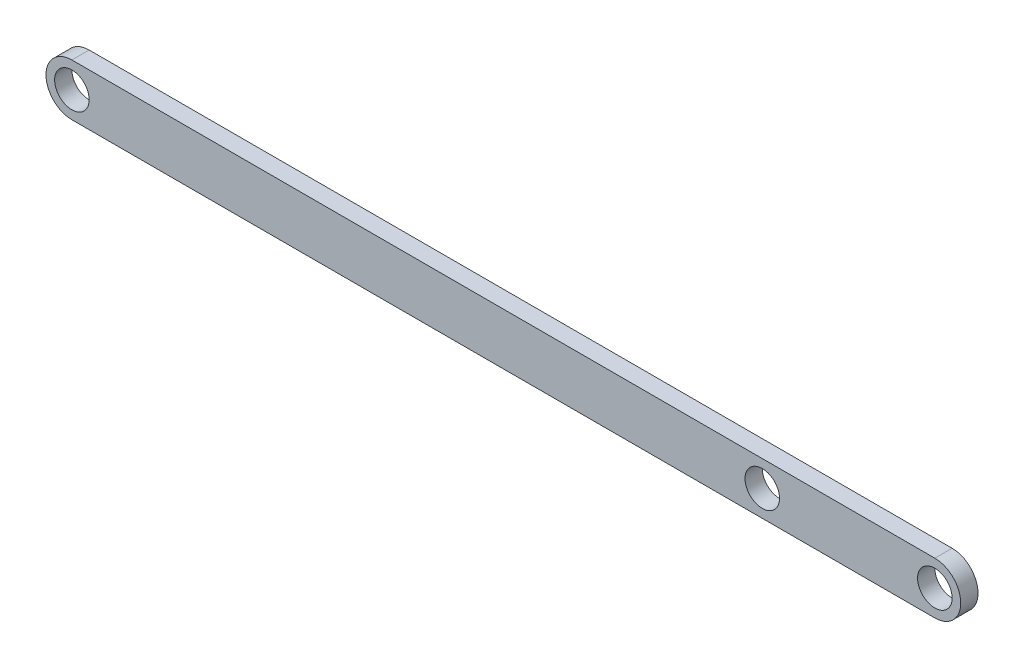
ISO-10303-21;
HEADER;
FILE_DESCRIPTION(('STEP AP214'),'2;1');
FILE_NAME('part.step','',(''),(''),'','','');
FILE_SCHEMA(('AUTOMOTIVE_DESIGN { 1 0 10303 214 1 1 1 1 }'));
ENDSEC;
DATA;
#1=APPLICATION_CONTEXT('core data for automotive mechanical design processes');
#2=APPLICATION_PROTOCOL_DEFINITION('international standard','automotive_design',2000,#1);
#3=PRODUCT_CONTEXT('',#1,'mechanical');
#4=PRODUCT('Part','Part','',(#3));
#5=PRODUCT_RELATED_PRODUCT_CATEGORY('part','',(#4));
#6=PRODUCT_DEFINITION_FORMATION('','',#4);
#7=PRODUCT_DEFINITION_CONTEXT('part definition',#1,'design');
#8=PRODUCT_DEFINITION('design','',#6,#7);
#9=PRODUCT_DEFINITION_SHAPE('','',#8);
#10=(LENGTH_UNIT() NAMED_UNIT(*) SI_UNIT(.MILLI.,.METRE.));
#11=(NAMED_UNIT(*) PLANE_ANGLE_UNIT() SI_UNIT($,.RADIAN.));
#12=(NAMED_UNIT(*) SI_UNIT($,.STERADIAN.) SOLID_ANGLE_UNIT());
#13=UNCERTAINTY_MEASURE_WITH_UNIT(LENGTH_MEASURE(1.E-05),#10,'distance_accuracy_value','');
#14=(GEOMETRIC_REPRESENTATION_CONTEXT(3) GLOBAL_UNCERTAINTY_ASSIGNED_CONTEXT((#13)) GLOBAL_UNIT_ASSIGNED_CONTEXT((#10,
#11,#12)) REPRESENTATION_CONTEXT('',''));
#15=CARTESIAN_POINT('',(0.,0.,0.));
#16=DIRECTION('',(0.,0.,1.));
#17=DIRECTION('',(1.,0.,0.));
#18=AXIS2_PLACEMENT_3D('',#15,#16,#17);
#19=CARTESIAN_POINT('',(0.,30.,10.));
#20=DIRECTION('',(0.,-1.,0.));
#21=DIRECTION('',(1.,0.,0.));
#22=AXIS2_PLACEMENT_3D('',#19,#20,#21);
#23=PLANE('',#22);
#24=DIRECTION('',(-1.,0.,0.));
#25=VECTOR('',#24,1.);
#26=CARTESIAN_POINT('',(0.,30.,0.));
#27=LINE('',#26,#25);
#28=CARTESIAN_POINT('',(0.,30.,0.));
#29=VERTEX_POINT('',#28);
#30=CARTESIAN_POINT('',(-500.,29.9999999999999,0.));
#31=VERTEX_POINT('',#30);
#32=EDGE_CURVE('E100',#29,#31,#27,.T.);
#33=ORIENTED_EDGE('',*,*,#32,.T.);
#34=DIRECTION('',(0.,0.,-1.));
#35=VECTOR('',#34,1.);
#36=CARTESIAN_POINT('',(-500.,29.9999999999999,10.));
#37=LINE('',#36,#35);
#38=CARTESIAN_POINT('',(-500.,29.9999999999999,10.));
#39=VERTEX_POINT('',#38);
#40=EDGE_CURVE('E11',#39,#31,#37,.T.);
#41=ORIENTED_EDGE('',*,*,#40,.F.);
#42=DIRECTION('',(-1.,0.,0.));
#43=VECTOR('',#42,1.);
#44=CARTESIAN_POINT('',(0.,30.,10.));
#45=LINE('',#44,#43);
#46=CARTESIAN_POINT('',(0.,30.,10.));
#47=VERTEX_POINT('',#46);
#48=EDGE_CURVE('E85',#47,#39,#45,.T.);
#49=ORIENTED_EDGE('',*,*,#48,.F.);
#50=DIRECTION('',(0.,0.,-1.));
#51=VECTOR('',#50,1.);
#52=CARTESIAN_POINT('',(0.,30.,10.));
#53=LINE('',#52,#51);
#54=EDGE_CURVE('E96',#47,#29,#53,.T.);
#55=ORIENTED_EDGE('',*,*,#54,.T.);
#56=EDGE_LOOP('',(#33,#41,#49,#55));
#57=FACE_BOUND('',#56,.T.);
#58=ADVANCED_FACE('F38',(#57),#23,.F.);
#59=CARTESIAN_POINT('',(-500.,14.9999999999999,10.));
#60=DIRECTION('',(0.,0.,-1.));
#61=DIRECTION('',(-1.,0.,0.));
#62=AXIS2_PLACEMENT_3D('',#59,#60,#61);
#63=CYLINDRICAL_SURFACE('',#62,15.);
#64=CARTESIAN_POINT('',(-500.,14.9999999999999,0.));
#65=DIRECTION('',(0.,0.,1.));
#66=DIRECTION('',(1.,0.,0.));
#67=AXIS2_PLACEMENT_3D('',#64,#65,#66);
#68=CIRCLE('',#67,15.);
#69=CARTESIAN_POINT('',(-500.,0.,0.));
#70=VERTEX_POINT('',#69);
#71=EDGE_CURVE('E90',#31,#70,#68,.T.);
#72=ORIENTED_EDGE('',*,*,#71,.T.);
#73=DIRECTION('',(0.,0.,-1.));
#74=VECTOR('',#73,1.);
#75=CARTESIAN_POINT('',(-500.,0.,10.));
#76=LINE('',#75,#74);
#77=CARTESIAN_POINT('',(-500.,0.,10.));
#78=VERTEX_POINT('',#77);
#79=EDGE_CURVE('E46',#78,#70,#76,.T.);
#80=ORIENTED_EDGE('',*,*,#79,.F.);
#81=CARTESIAN_POINT('',(-500.,14.9999999999999,10.));
#82=DIRECTION('',(0.,0.,1.));
#83=DIRECTION('',(1.,0.,0.));
#84=AXIS2_PLACEMENT_3D('',#81,#82,#83);
#85=CIRCLE('',#84,15.);
#86=EDGE_CURVE('E80',#39,#78,#85,.T.);
#87=ORIENTED_EDGE('',*,*,#86,.F.);
#88=ORIENTED_EDGE('',*,*,#40,.T.);
#89=EDGE_LOOP('',(#72,#80,#87,#88));
#90=FACE_BOUND('',#89,.T.);
#91=ADVANCED_FACE('F89',(#90),#63,.T.);
#92=CARTESIAN_POINT('',(0.,0.,10.));
#93=DIRECTION('',(0.,-1.,0.));
#94=DIRECTION('',(1.,0.,0.));
#95=AXIS2_PLACEMENT_3D('',#92,#93,#94);
#96=PLANE('',#95);
#97=DIRECTION('',(-1.,0.,0.));
#98=VECTOR('',#97,1.);
#99=CARTESIAN_POINT('',(0.,0.,0.));
#100=LINE('',#99,#98);
#101=CARTESIAN_POINT('',(0.,0.,0.));
#102=VERTEX_POINT('',#101);
#103=EDGE_CURVE('E105',#102,#70,#100,.T.);
#104=ORIENTED_EDGE('',*,*,#103,.F.);
#105=DIRECTION('',(0.,0.,-1.));
#106=VECTOR('',#105,1.);
#107=CARTESIAN_POINT('',(0.,0.,10.));
#108=LINE('',#107,#106);
#109=CARTESIAN_POINT('',(0.,0.,10.));
#110=VERTEX_POINT('',#109);
#111=EDGE_CURVE('E70',#110,#102,#108,.T.);
#112=ORIENTED_EDGE('',*,*,#111,.F.);
#113=DIRECTION('',(-1.,0.,0.));
#114=VECTOR('',#113,1.);
#115=CARTESIAN_POINT('',(0.,0.,10.));
#116=LINE('',#115,#114);
#117=EDGE_CURVE('E83',#110,#78,#116,.T.);
#118=ORIENTED_EDGE('',*,*,#117,.T.);
#119=ORIENTED_EDGE('',*,*,#79,.T.);
#120=EDGE_LOOP('',(#104,#112,#118,#119));
#121=FACE_BOUND('',#120,.T.);
#122=ADVANCED_FACE('F94',(#121),#96,.T.);
#123=CARTESIAN_POINT('',(0.,15.,10.));
#124=DIRECTION('',(0.,0.,-1.));
#125=DIRECTION('',(-1.,0.,0.));
#126=AXIS2_PLACEMENT_3D('',#123,#124,#125);
#127=CYLINDRICAL_SURFACE('',#126,15.);
#128=CARTESIAN_POINT('',(0.,15.,0.));
#129=DIRECTION('',(0.,0.,1.));
#130=DIRECTION('',(1.,0.,0.));
#131=AXIS2_PLACEMENT_3D('',#128,#129,#130);
#132=CIRCLE('',#131,15.);
#133=EDGE_CURVE('E73',#102,#29,#132,.T.);
#134=ORIENTED_EDGE('',*,*,#133,.T.);
#135=ORIENTED_EDGE('',*,*,#54,.F.);
#136=CARTESIAN_POINT('',(0.,15.,10.));
#137=DIRECTION('',(0.,0.,1.));
#138=DIRECTION('',(1.,0.,0.));
#139=AXIS2_PLACEMENT_3D('',#136,#137,#138);
#140=CIRCLE('',#139,15.);
#141=EDGE_CURVE('E54',#110,#47,#140,.T.);
#142=ORIENTED_EDGE('',*,*,#141,.F.);
#143=ORIENTED_EDGE('',*,*,#111,.T.);
#144=EDGE_LOOP('',(#134,#135,#142,#143));
#145=FACE_BOUND('',#144,.T.);
#146=ADVANCED_FACE('F124',(#145),#127,.T.);
#147=CARTESIAN_POINT('',(-500.,14.9999999999999,10.));
#148=DIRECTION('',(0.,0.,1.));
#149=DIRECTION('',(1.,0.,0.));
#150=AXIS2_PLACEMENT_3D('',#147,#148,#149);
#151=PLANE('',#150);
#152=CARTESIAN_POINT('',(-100.,15.,10.));
#153=DIRECTION('',(0.,0.,1.));
#154=DIRECTION('',(1.,0.,0.));
#155=AXIS2_PLACEMENT_3D('',#152,#153,#154);
#156=CIRCLE('',#155,10.);
#157=CARTESIAN_POINT('',(-90.,15.,10.));
#158=VERTEX_POINT('',#157);
#159=EDGE_CURVE('E198',#158,#158,#156,.T.);
#160=ORIENTED_EDGE('',*,*,#159,.F.);
#161=EDGE_LOOP('',(#160));
#162=FACE_BOUND('',#161,.T.);
#163=CARTESIAN_POINT('',(0.,15.,10.));
#164=DIRECTION('',(0.,0.,-1.));
#165=DIRECTION('',(-1.,0.,0.));
#166=AXIS2_PLACEMENT_3D('',#163,#164,#165);
#167=CIRCLE('',#166,10.);
#168=CARTESIAN_POINT('',(-10.,15.,10.));
#169=VERTEX_POINT('',#168);
#170=EDGE_CURVE('E103',#169,#169,#167,.T.);
#171=ORIENTED_EDGE('',*,*,#170,.T.);
#172=EDGE_LOOP('',(#171));
#173=FACE_BOUND('',#172,.T.);
#174=CARTESIAN_POINT('',(-500.,14.9999999999999,10.));
#175=DIRECTION('',(0.,0.,-1.));
#176=DIRECTION('',(-1.,0.,0.));
#177=AXIS2_PLACEMENT_3D('',#174,#175,#176);
#178=CIRCLE('',#177,9.99999999999998);
#179=CARTESIAN_POINT('',(-510.,14.9999999999999,10.));
#180=VERTEX_POINT('',#179);
#181=EDGE_CURVE('E186',#180,#180,#178,.T.);
#182=ORIENTED_EDGE('',*,*,#181,.T.);
#183=EDGE_LOOP('',(#182));
#184=FACE_BOUND('',#183,.T.);
#185=ORIENTED_EDGE('',*,*,#48,.T.);
#186=ORIENTED_EDGE('',*,*,#86,.T.);
#187=ORIENTED_EDGE('',*,*,#117,.F.);
#188=ORIENTED_EDGE('',*,*,#141,.T.);
#189=EDGE_LOOP('',(#185,#186,#187,#188));
#190=FACE_BOUND('',#189,.T.);
#191=ADVANCED_FACE('F81',(#162,#173,#184,#190),#151,.T.);
#192=CARTESIAN_POINT('',(-500.,14.9999999999999,0.));
#193=DIRECTION('',(0.,0.,1.));
#194=DIRECTION('',(1.,0.,0.));
#195=AXIS2_PLACEMENT_3D('',#192,#193,#194);
#196=PLANE('',#195);
#197=CARTESIAN_POINT('',(-100.,15.,0.));
#198=DIRECTION('',(0.,0.,1.));
#199=DIRECTION('',(1.,0.,0.));
#200=AXIS2_PLACEMENT_3D('',#197,#198,#199);
#201=CIRCLE('',#200,10.);
#202=CARTESIAN_POINT('',(-90.,15.,0.));
#203=VERTEX_POINT('',#202);
#204=EDGE_CURVE('E195',#203,#203,#201,.T.);
#205=ORIENTED_EDGE('',*,*,#204,.T.);
#206=EDGE_LOOP('',(#205));
#207=FACE_BOUND('',#206,.T.);
#208=CARTESIAN_POINT('',(0.,15.,0.));
#209=DIRECTION('',(0.,0.,-1.));
#210=DIRECTION('',(-1.,0.,0.));
#211=AXIS2_PLACEMENT_3D('',#208,#209,#210);
#212=CIRCLE('',#211,10.);
#213=CARTESIAN_POINT('',(-10.,15.,0.));
#214=VERTEX_POINT('',#213);
#215=EDGE_CURVE('E185',#214,#214,#212,.T.);
#216=ORIENTED_EDGE('',*,*,#215,.F.);
#217=EDGE_LOOP('',(#216));
#218=FACE_BOUND('',#217,.T.);
#219=CARTESIAN_POINT('',(-500.,14.9999999999999,0.));
#220=DIRECTION('',(0.,0.,-1.));
#221=DIRECTION('',(-1.,0.,0.));
#222=AXIS2_PLACEMENT_3D('',#219,#220,#221);
#223=CIRCLE('',#222,9.99999999999998);
#224=CARTESIAN_POINT('',(-510.,14.9999999999999,0.));
#225=VERTEX_POINT('',#224);
#226=EDGE_CURVE('E190',#225,#225,#223,.T.);
#227=ORIENTED_EDGE('',*,*,#226,.F.);
#228=EDGE_LOOP('',(#227));
#229=FACE_BOUND('',#228,.T.);
#230=ORIENTED_EDGE('',*,*,#32,.F.);
#231=ORIENTED_EDGE('',*,*,#133,.F.);
#232=ORIENTED_EDGE('',*,*,#103,.T.);
#233=ORIENTED_EDGE('',*,*,#71,.F.);
#234=EDGE_LOOP('',(#230,#231,#232,#233));
#235=FACE_BOUND('',#234,.T.);
#236=ADVANCED_FACE('F112',(#207,#218,#229,#235),#196,.F.);
#237=CARTESIAN_POINT('',(-500.,14.9999999999999,10.));
#238=DIRECTION('',(0.,0.,-1.));
#239=DIRECTION('',(-1.,0.,0.));
#240=AXIS2_PLACEMENT_3D('',#237,#238,#239);
#241=CYLINDRICAL_SURFACE('',#240,9.99999999999998);
#242=ORIENTED_EDGE('',*,*,#181,.F.);
#243=EDGE_LOOP('',(#242));
#244=FACE_BOUND('',#243,.T.);
#245=ORIENTED_EDGE('',*,*,#226,.T.);
#246=EDGE_LOOP('',(#245));
#247=FACE_BOUND('',#246,.T.);
#248=ADVANCED_FACE('F114',(#244,#247),#241,.F.);
#249=CARTESIAN_POINT('',(0.,15.,10.));
#250=DIRECTION('',(0.,0.,-1.));
#251=DIRECTION('',(-1.,0.,0.));
#252=AXIS2_PLACEMENT_3D('',#249,#250,#251);
#253=CYLINDRICAL_SURFACE('',#252,10.);
#254=ORIENTED_EDGE('',*,*,#170,.F.);
#255=EDGE_LOOP('',(#254));
#256=FACE_BOUND('',#255,.T.);
#257=ORIENTED_EDGE('',*,*,#215,.T.);
#258=EDGE_LOOP('',(#257));
#259=FACE_BOUND('',#258,.T.);
#260=ADVANCED_FACE('F121',(#256,#259),#253,.F.);
#261=CARTESIAN_POINT('',(-100.,15.,0.));
#262=DIRECTION('',(0.,0.,1.));
#263=DIRECTION('',(1.,0.,0.));
#264=AXIS2_PLACEMENT_3D('',#261,#262,#263);
#265=CYLINDRICAL_SURFACE('',#264,10.);
#266=ORIENTED_EDGE('',*,*,#204,.F.);
#267=EDGE_LOOP('',(#266));
#268=FACE_BOUND('',#267,.T.);
#269=ORIENTED_EDGE('',*,*,#159,.T.);
#270=EDGE_LOOP('',(#269));
#271=FACE_BOUND('',#270,.T.);
#272=ADVANCED_FACE('F162',(#268,#271),#265,.F.);
#273=CLOSED_SHELL('',(#58,#91,#122,#146,#191,#236,#248,#260,#272));
#274=MANIFOLD_SOLID_BREP('B2',#273);
#275=ADVANCED_BREP_SHAPE_REPRESENTATION('',(#18,#274),#14);
#276=SHAPE_DEFINITION_REPRESENTATION(#9,#275);
ENDSEC;
END-ISO-10303-21;
